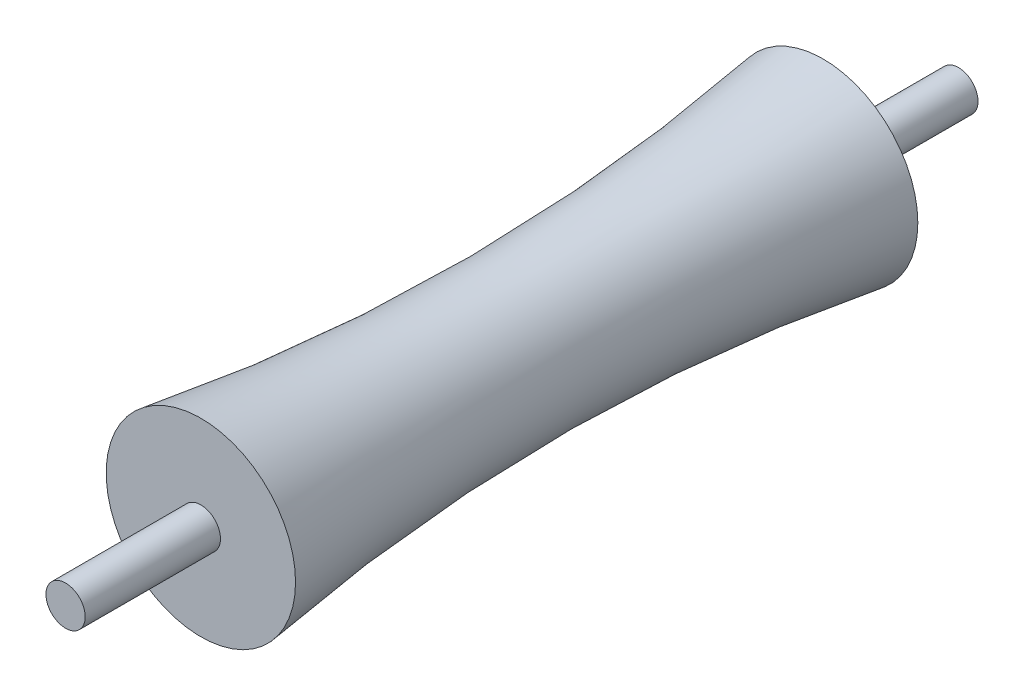
ISO-10303-21;
HEADER;
FILE_DESCRIPTION(('STEP AP214'),'2;1');
FILE_NAME('part.step','',(''),(''),'','','');
FILE_SCHEMA(('AUTOMOTIVE_DESIGN { 1 0 10303 214 1 1 1 1 }'));
ENDSEC;
DATA;
#1=APPLICATION_CONTEXT('core data for automotive mechanical design processes');
#2=APPLICATION_PROTOCOL_DEFINITION('international standard','automotive_design',2000,#1);
#3=PRODUCT_CONTEXT('',#1,'mechanical');
#4=PRODUCT('Part','Part','',(#3));
#5=PRODUCT_RELATED_PRODUCT_CATEGORY('part','',(#4));
#6=PRODUCT_DEFINITION_FORMATION('','',#4);
#7=PRODUCT_DEFINITION_CONTEXT('part definition',#1,'design');
#8=PRODUCT_DEFINITION('design','',#6,#7);
#9=PRODUCT_DEFINITION_SHAPE('','',#8);
#10=(LENGTH_UNIT() NAMED_UNIT(*) SI_UNIT(.MILLI.,.METRE.));
#11=(NAMED_UNIT(*) PLANE_ANGLE_UNIT() SI_UNIT($,.RADIAN.));
#12=(NAMED_UNIT(*) SI_UNIT($,.STERADIAN.) SOLID_ANGLE_UNIT());
#13=UNCERTAINTY_MEASURE_WITH_UNIT(LENGTH_MEASURE(1.E-05),#10,'distance_accuracy_value','');
#14=(GEOMETRIC_REPRESENTATION_CONTEXT(3) GLOBAL_UNCERTAINTY_ASSIGNED_CONTEXT((#13)) GLOBAL_UNIT_ASSIGNED_CONTEXT((#10,
#11,#12)) REPRESENTATION_CONTEXT('',''));
#15=CARTESIAN_POINT('',(0.,0.,0.));
#16=DIRECTION('',(0.,0.,1.));
#17=DIRECTION('',(1.,0.,0.));
#18=AXIS2_PLACEMENT_3D('',#15,#16,#17);
#19=CARTESIAN_POINT('',(0.,0.,0.));
#20=DIRECTION('',(0.,0.,1.));
#21=DIRECTION('',(1.,0.,0.));
#22=AXIS2_PLACEMENT_3D('',#19,#20,#21);
#23=PLANE('',#22);
#24=CARTESIAN_POINT('',(0.,0.,0.));
#25=DIRECTION('',(0.,0.,1.));
#26=DIRECTION('',(1.,0.,0.));
#27=AXIS2_PLACEMENT_3D('',#24,#25,#26);
#28=CIRCLE('',#27,1.45);
#29=CARTESIAN_POINT('',(1.45,0.,0.));
#30=VERTEX_POINT('',#29);
#31=EDGE_CURVE('E42',#30,#30,#28,.T.);
#32=ORIENTED_EDGE('',*,*,#31,.F.);
#33=EDGE_LOOP('',(#32));
#34=FACE_BOUND('',#33,.T.);
#35=CARTESIAN_POINT('',(0.,0.,0.));
#36=DIRECTION('',(0.,0.,1.));
#37=DIRECTION('',(1.,0.,0.));
#38=AXIS2_PLACEMENT_3D('',#35,#36,#37);
#39=CIRCLE('',#38,7.00000000000001);
#40=CARTESIAN_POINT('',(7.00000000000001,0.,0.));
#41=VERTEX_POINT('',#40);
#42=EDGE_CURVE('E53',#41,#41,#39,.T.);
#43=ORIENTED_EDGE('',*,*,#42,.T.);
#44=EDGE_LOOP('',(#43));
#45=FACE_BOUND('',#44,.T.);
#46=ADVANCED_FACE('F35',(#34,#45),#23,.T.);
#47=CARTESIAN_POINT('',(0.,0.,-46.));
#48=DIRECTION('',(0.,0.,-1.));
#49=DIRECTION('',(-1.,0.,0.));
#50=AXIS2_PLACEMENT_3D('',#47,#48,#49);
#51=PLANE('',#50);
#52=CARTESIAN_POINT('',(0.,0.,-46.));
#53=DIRECTION('',(0.,0.,-1.));
#54=DIRECTION('',(-1.,0.,0.));
#55=AXIS2_PLACEMENT_3D('',#52,#53,#54);
#56=CIRCLE('',#55,1.45);
#57=CARTESIAN_POINT('',(-1.45,0.,-46.));
#58=VERTEX_POINT('',#57);
#59=EDGE_CURVE('E10',#58,#58,#56,.T.);
#60=ORIENTED_EDGE('',*,*,#59,.F.);
#61=EDGE_LOOP('',(#60));
#62=FACE_BOUND('',#61,.T.);
#63=CARTESIAN_POINT('',(0.,0.,-46.));
#64=DIRECTION('',(0.,0.,1.));
#65=DIRECTION('',(1.,0.,0.));
#66=AXIS2_PLACEMENT_3D('',#63,#64,#65);
#67=CIRCLE('',#66,7.);
#68=CARTESIAN_POINT('',(7.,0.,-46.));
#69=VERTEX_POINT('',#68);
#70=EDGE_CURVE('E38',#69,#69,#67,.T.);
#71=ORIENTED_EDGE('',*,*,#70,.F.);
#72=EDGE_LOOP('',(#71));
#73=FACE_BOUND('',#72,.T.);
#74=ADVANCED_FACE('F63',(#62,#73),#51,.T.);
#75=CARTESIAN_POINT('',(0.,0.,-23.));
#76=DIRECTION('',(0.,0.,1.));
#77=DIRECTION('',(1.,0.,0.));
#78=AXIS2_PLACEMENT_3D('',#75,#76,#77);
#79=TOROIDAL_SURFACE('',#78,155.226178524578,150.);
#80=ORIENTED_EDGE('',*,*,#70,.T.);
#81=EDGE_LOOP('',(#80));
#82=FACE_BOUND('',#81,.T.);
#83=ORIENTED_EDGE('',*,*,#42,.F.);
#84=EDGE_LOOP('',(#83));
#85=FACE_BOUND('',#84,.T.);
#86=ADVANCED_FACE('F60',(#82,#85),#79,.F.);
#87=CARTESIAN_POINT('',(0.,0.,10.));
#88=DIRECTION('',(0.,0.,-1.));
#89=DIRECTION('',(-1.,0.,0.));
#90=AXIS2_PLACEMENT_3D('',#87,#88,#89);
#91=CYLINDRICAL_SURFACE('',#90,1.45);
#92=CARTESIAN_POINT('',(0.,0.,10.));
#93=DIRECTION('',(0.,0.,1.));
#94=DIRECTION('',(1.,0.,0.));
#95=AXIS2_PLACEMENT_3D('',#92,#93,#94);
#96=CIRCLE('',#95,1.45);
#97=CARTESIAN_POINT('',(1.45,0.,10.));
#98=VERTEX_POINT('',#97);
#99=EDGE_CURVE('E51',#98,#98,#96,.T.);
#100=ORIENTED_EDGE('',*,*,#99,.F.);
#101=EDGE_LOOP('',(#100));
#102=FACE_BOUND('',#101,.T.);
#103=ORIENTED_EDGE('',*,*,#31,.T.);
#104=EDGE_LOOP('',(#103));
#105=FACE_BOUND('',#104,.T.);
#106=ADVANCED_FACE('F70',(#102,#105),#91,.T.);
#107=CARTESIAN_POINT('',(0.,0.,10.));
#108=DIRECTION('',(0.,0.,1.));
#109=DIRECTION('',(1.,0.,0.));
#110=AXIS2_PLACEMENT_3D('',#107,#108,#109);
#111=PLANE('',#110);
#112=ORIENTED_EDGE('',*,*,#99,.T.);
#113=EDGE_LOOP('',(#112));
#114=FACE_BOUND('',#113,.T.);
#115=ADVANCED_FACE('F76',(#114),#111,.T.);
#116=CARTESIAN_POINT('',(0.,0.,-56.));
#117=DIRECTION('',(0.,0.,1.));
#118=DIRECTION('',(1.,0.,0.));
#119=AXIS2_PLACEMENT_3D('',#116,#117,#118);
#120=CYLINDRICAL_SURFACE('',#119,1.45);
#121=CARTESIAN_POINT('',(0.,0.,-56.));
#122=DIRECTION('',(0.,0.,-1.));
#123=DIRECTION('',(-1.,0.,0.));
#124=AXIS2_PLACEMENT_3D('',#121,#122,#123);
#125=CIRCLE('',#124,1.45);
#126=CARTESIAN_POINT('',(-1.45,0.,-56.));
#127=VERTEX_POINT('',#126);
#128=EDGE_CURVE('E50',#127,#127,#125,.T.);
#129=ORIENTED_EDGE('',*,*,#128,.F.);
#130=EDGE_LOOP('',(#129));
#131=FACE_BOUND('',#130,.T.);
#132=ORIENTED_EDGE('',*,*,#59,.T.);
#133=EDGE_LOOP('',(#132));
#134=FACE_BOUND('',#133,.T.);
#135=ADVANCED_FACE('F80',(#131,#134),#120,.T.);
#136=CARTESIAN_POINT('',(0.,0.,-56.));
#137=DIRECTION('',(0.,0.,-1.));
#138=DIRECTION('',(-1.,0.,0.));
#139=AXIS2_PLACEMENT_3D('',#136,#137,#138);
#140=PLANE('',#139);
#141=ORIENTED_EDGE('',*,*,#128,.T.);
#142=EDGE_LOOP('',(#141));
#143=FACE_BOUND('',#142,.T.);
#144=ADVANCED_FACE('F84',(#143),#140,.T.);
#145=CLOSED_SHELL('',(#46,#74,#86,#106,#115,#135,#144));
#146=MANIFOLD_SOLID_BREP('B2',#145);
#147=ADVANCED_BREP_SHAPE_REPRESENTATION('',(#18,#146),#14);
#148=SHAPE_DEFINITION_REPRESENTATION(#9,#147);
ENDSEC;
END-ISO-10303-21;
